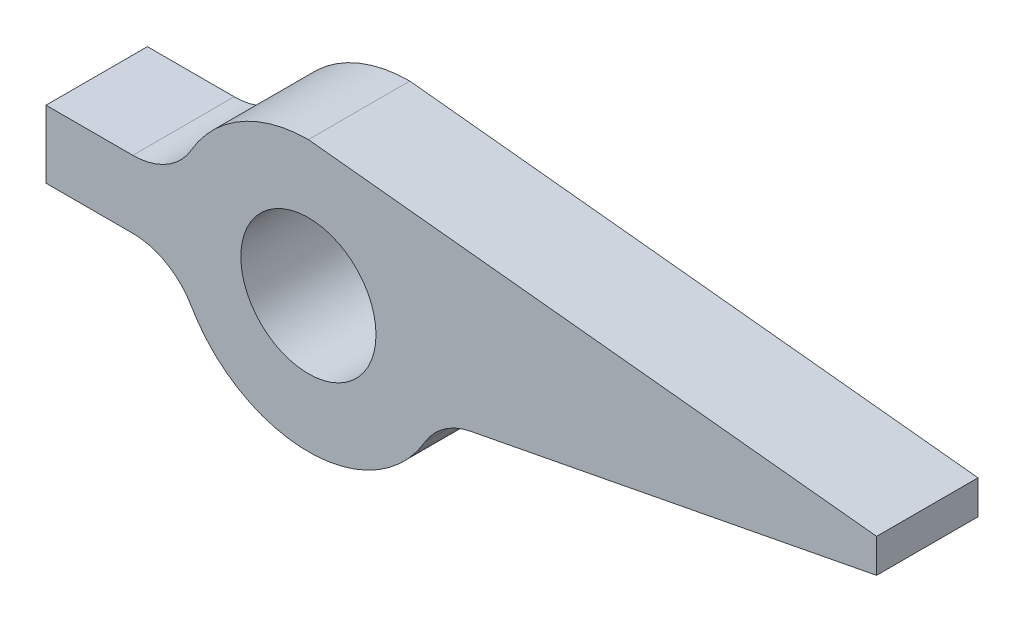
ISO-10303-21;
HEADER;
FILE_DESCRIPTION(('STEP AP214'),'2;1');
FILE_NAME('part.step','',(''),(''),'','','');
FILE_SCHEMA(('AUTOMOTIVE_DESIGN { 1 0 10303 214 1 1 1 1 }'));
ENDSEC;
DATA;
#1=APPLICATION_CONTEXT('core data for automotive mechanical design processes');
#2=APPLICATION_PROTOCOL_DEFINITION('international standard','automotive_design',2000,#1);
#3=PRODUCT_CONTEXT('',#1,'mechanical');
#4=PRODUCT('Part','Part','',(#3));
#5=PRODUCT_RELATED_PRODUCT_CATEGORY('part','',(#4));
#6=PRODUCT_DEFINITION_FORMATION('','',#4);
#7=PRODUCT_DEFINITION_CONTEXT('part definition',#1,'design');
#8=PRODUCT_DEFINITION('design','',#6,#7);
#9=PRODUCT_DEFINITION_SHAPE('','',#8);
#10=(LENGTH_UNIT() NAMED_UNIT(*) SI_UNIT(.MILLI.,.METRE.));
#11=(NAMED_UNIT(*) PLANE_ANGLE_UNIT() SI_UNIT($,.RADIAN.));
#12=(NAMED_UNIT(*) SI_UNIT($,.STERADIAN.) SOLID_ANGLE_UNIT());
#13=UNCERTAINTY_MEASURE_WITH_UNIT(LENGTH_MEASURE(1.E-05),#10,'distance_accuracy_value','');
#14=(GEOMETRIC_REPRESENTATION_CONTEXT(3) GLOBAL_UNCERTAINTY_ASSIGNED_CONTEXT((#13)) GLOBAL_UNIT_ASSIGNED_CONTEXT((#10,
#11,#12)) REPRESENTATION_CONTEXT('',''));
#15=CARTESIAN_POINT('',(0.,0.,0.));
#16=DIRECTION('',(0.,0.,1.));
#17=DIRECTION('',(1.,0.,0.));
#18=AXIS2_PLACEMENT_3D('',#15,#16,#17);
#19=CARTESIAN_POINT('',(1.80959474624118,17.2869736289204,1.5));
#20=DIRECTION('',(0.104110812603087,0.994565703560667,0.));
#21=DIRECTION('',(-0.994565703560667,0.104110812603087,0.));
#22=AXIS2_PLACEMENT_3D('',#19,#20,#21);
#23=PLANE('',#22);
#24=DIRECTION('',(0.994565703560667,-0.104110812603087,0.));
#25=VECTOR('',#24,1.);
#26=CARTESIAN_POINT('',(1.80959474624118,17.2869736289204,0.));
#27=LINE('',#26,#25);
#28=CARTESIAN_POINT('',(-11.2160550410776,18.6504943889727,0.));
#29=VERTEX_POINT('',#28);
#30=CARTESIAN_POINT('',(-2.80993463836175,17.7705444542093,0.));
#31=VERTEX_POINT('',#30);
#32=EDGE_CURVE('E123',#29,#31,#27,.T.);
#33=ORIENTED_EDGE('',*,*,#32,.F.);
#34=DIRECTION('',(0.,0.,-1.));
#35=VECTOR('',#34,1.);
#36=CARTESIAN_POINT('',(-11.2160550410776,18.6504943889727,1.5));
#37=LINE('',#36,#35);
#38=CARTESIAN_POINT('',(-11.2160550410776,18.6504943889727,1.5));
#39=VERTEX_POINT('',#38);
#40=EDGE_CURVE('E117',#39,#29,#37,.T.);
#41=ORIENTED_EDGE('',*,*,#40,.F.);
#42=DIRECTION('',(0.994565703560667,-0.104110812603087,0.));
#43=VECTOR('',#42,1.);
#44=CARTESIAN_POINT('',(1.80959474624118,17.2869736289204,1.5));
#45=LINE('',#44,#43);
#46=CARTESIAN_POINT('',(-2.80993463836175,17.7705444542093,1.5));
#47=VERTEX_POINT('',#46);
#48=EDGE_CURVE('E120',#39,#47,#45,.T.);
#49=ORIENTED_EDGE('',*,*,#48,.T.);
#50=DIRECTION('',(0.,0.,-1.));
#51=VECTOR('',#50,1.);
#52=CARTESIAN_POINT('',(-2.80993463836175,17.7705444542093,1.5));
#53=LINE('',#52,#51);
#54=EDGE_CURVE('E166',#47,#31,#53,.T.);
#55=ORIENTED_EDGE('',*,*,#54,.T.);
#56=EDGE_LOOP('',(#33,#41,#49,#55));
#57=FACE_BOUND('',#56,.T.);
#58=ADVANCED_FACE('F34',(#57),#23,.T.);
#59=CARTESIAN_POINT('',(-11.2160550410776,16.6504943889727,1.5));
#60=DIRECTION('',(0.,0.,-1.));
#61=DIRECTION('',(-1.,0.,0.));
#62=AXIS2_PLACEMENT_3D('',#59,#60,#61);
#63=CYLINDRICAL_SURFACE('',#62,2.);
#64=CARTESIAN_POINT('',(-11.2160550410776,16.6504943889727,0.));
#65=DIRECTION('',(0.,0.,1.));
#66=DIRECTION('',(1.,0.,0.));
#67=AXIS2_PLACEMENT_3D('',#64,#65,#66);
#68=CIRCLE('',#67,2.);
#69=CARTESIAN_POINT('',(-12.9481058486464,17.6504943889727,0.));
#70=VERTEX_POINT('',#69);
#71=EDGE_CURVE('E168',#29,#70,#68,.T.);
#72=ORIENTED_EDGE('',*,*,#71,.T.);
#73=DIRECTION('',(0.,0.,-1.));
#74=VECTOR('',#73,1.);
#75=CARTESIAN_POINT('',(-12.9481058486464,17.6504943889727,1.5));
#76=LINE('',#75,#74);
#77=CARTESIAN_POINT('',(-12.9481058486464,17.6504943889727,1.5));
#78=VERTEX_POINT('',#77);
#79=EDGE_CURVE('E134',#70,#78,#76,.F.);
#80=ORIENTED_EDGE('',*,*,#79,.T.);
#81=CARTESIAN_POINT('',(-11.2160550410776,16.6504943889727,1.5));
#82=DIRECTION('',(0.,0.,1.));
#83=DIRECTION('',(1.,0.,0.));
#84=AXIS2_PLACEMENT_3D('',#81,#82,#83);
#85=CIRCLE('',#84,2.);
#86=EDGE_CURVE('E131',#39,#78,#85,.T.);
#87=ORIENTED_EDGE('',*,*,#86,.F.);
#88=ORIENTED_EDGE('',*,*,#40,.T.);
#89=EDGE_LOOP('',(#72,#80,#87,#88));
#90=FACE_BOUND('',#89,.T.);
#91=ADVANCED_FACE('F132',(#90),#63,.T.);
#92=CARTESIAN_POINT('',(0.,17.1504943889727,1.5));
#93=DIRECTION('',(0.,1.,0.));
#94=DIRECTION('',(0.,0.,1.));
#95=AXIS2_PLACEMENT_3D('',#92,#93,#94);
#96=PLANE('',#95);
#97=DIRECTION('',(1.,0.,0.));
#98=VECTOR('',#97,1.);
#99=CARTESIAN_POINT('',(0.,17.1504943889727,1.5));
#100=LINE('',#99,#98);
#101=CARTESIAN_POINT('',(-15.0981058486465,17.1504943889727,1.5));
#102=VERTEX_POINT('',#101);
#103=CARTESIAN_POINT('',(-13.8141312524309,17.1504943889727,1.5));
#104=VERTEX_POINT('',#103);
#105=EDGE_CURVE('E137',#102,#104,#100,.T.);
#106=ORIENTED_EDGE('',*,*,#105,.T.);
#107=DIRECTION('',(0.,0.,-1.));
#108=VECTOR('',#107,1.);
#109=CARTESIAN_POINT('',(-13.8141312524309,17.1504943889727,1.5));
#110=LINE('',#109,#108);
#111=CARTESIAN_POINT('',(-13.8141312524309,17.1504943889727,0.));
#112=VERTEX_POINT('',#111);
#113=EDGE_CURVE('E198',#104,#112,#110,.T.);
#114=ORIENTED_EDGE('',*,*,#113,.T.);
#115=DIRECTION('',(1.,0.,0.));
#116=VECTOR('',#115,1.);
#117=CARTESIAN_POINT('',(0.,17.1504943889727,0.));
#118=LINE('',#117,#116);
#119=CARTESIAN_POINT('',(-15.0981058486465,17.1504943889727,0.));
#120=VERTEX_POINT('',#119);
#121=EDGE_CURVE('E170',#120,#112,#118,.T.);
#122=ORIENTED_EDGE('',*,*,#121,.F.);
#123=DIRECTION('',(0.,0.,-1.));
#124=VECTOR('',#123,1.);
#125=CARTESIAN_POINT('',(-15.0981058486465,17.1504943889727,1.5));
#126=LINE('',#125,#124);
#127=EDGE_CURVE('E128',#102,#120,#126,.T.);
#128=ORIENTED_EDGE('',*,*,#127,.F.);
#129=EDGE_LOOP('',(#106,#114,#122,#128));
#130=FACE_BOUND('',#129,.T.);
#131=ADVANCED_FACE('F232',(#130),#96,.T.);
#132=CARTESIAN_POINT('',(-15.0981058486465,0.,1.5));
#133=DIRECTION('',(-1.,0.,0.));
#134=DIRECTION('',(0.,0.,1.));
#135=AXIS2_PLACEMENT_3D('',#132,#133,#134);
#136=PLANE('',#135);
#137=DIRECTION('',(0.,1.,0.));
#138=VECTOR('',#137,1.);
#139=CARTESIAN_POINT('',(-15.0981058486465,0.,0.));
#140=LINE('',#139,#138);
#141=CARTESIAN_POINT('',(-15.0981058486465,16.1504943889727,0.));
#142=VERTEX_POINT('',#141);
#143=EDGE_CURVE('E174',#142,#120,#140,.T.);
#144=ORIENTED_EDGE('',*,*,#143,.F.);
#145=DIRECTION('',(0.,0.,-1.));
#146=VECTOR('',#145,1.);
#147=CARTESIAN_POINT('',(-15.0981058486465,16.1504943889727,1.5));
#148=LINE('',#147,#146);
#149=CARTESIAN_POINT('',(-15.0981058486465,16.1504943889727,1.5));
#150=VERTEX_POINT('',#149);
#151=EDGE_CURVE('E187',#150,#142,#148,.T.);
#152=ORIENTED_EDGE('',*,*,#151,.F.);
#153=DIRECTION('',(0.,1.,0.));
#154=VECTOR('',#153,1.);
#155=CARTESIAN_POINT('',(-15.0981058486465,0.,1.5));
#156=LINE('',#155,#154);
#157=EDGE_CURVE('E153',#150,#102,#156,.T.);
#158=ORIENTED_EDGE('',*,*,#157,.T.);
#159=ORIENTED_EDGE('',*,*,#127,.T.);
#160=EDGE_LOOP('',(#144,#152,#158,#159));
#161=FACE_BOUND('',#160,.T.);
#162=ADVANCED_FACE('F254',(#161),#136,.T.);
#163=CARTESIAN_POINT('',(0.,16.1504943889727,1.5));
#164=DIRECTION('',(0.,1.,0.));
#165=DIRECTION('',(0.,0.,1.));
#166=AXIS2_PLACEMENT_3D('',#163,#164,#165);
#167=PLANE('',#166);
#168=DIRECTION('',(1.,0.,0.));
#169=VECTOR('',#168,1.);
#170=CARTESIAN_POINT('',(0.,16.1504943889727,0.));
#171=LINE('',#170,#169);
#172=CARTESIAN_POINT('',(-13.8141312524309,16.1504943889727,0.));
#173=VERTEX_POINT('',#172);
#174=EDGE_CURVE('E177',#142,#173,#171,.T.);
#175=ORIENTED_EDGE('',*,*,#174,.T.);
#176=DIRECTION('',(0.,0.,1.));
#177=VECTOR('',#176,1.);
#178=CARTESIAN_POINT('',(-13.8141312524309,16.1504943889727,1.5));
#179=LINE('',#178,#177);
#180=CARTESIAN_POINT('',(-13.8141312524309,16.1504943889727,1.5));
#181=VERTEX_POINT('',#180);
#182=EDGE_CURVE('E192',#173,#181,#179,.T.);
#183=ORIENTED_EDGE('',*,*,#182,.T.);
#184=DIRECTION('',(1.,0.,0.));
#185=VECTOR('',#184,1.);
#186=CARTESIAN_POINT('',(0.,16.1504943889727,1.5));
#187=LINE('',#186,#185);
#188=EDGE_CURVE('E156',#150,#181,#187,.T.);
#189=ORIENTED_EDGE('',*,*,#188,.F.);
#190=ORIENTED_EDGE('',*,*,#151,.T.);
#191=EDGE_LOOP('',(#175,#183,#189,#190));
#192=FACE_BOUND('',#191,.T.);
#193=ADVANCED_FACE('F252',(#192),#167,.F.);
#194=CARTESIAN_POINT('',(-12.9481058486465,15.6504943889727,0.));
#195=VERTEX_POINT('',#194);
#196=CARTESIAN_POINT('',(-9.49174390059453,15.6372071193369,0.));
#197=VERTEX_POINT('',#196);
#198=EDGE_CURVE('E171',#195,#197,#68,.T.);
#199=ORIENTED_EDGE('',*,*,#198,.T.);
#200=DIRECTION('',(0.,0.,-1.));
#201=VECTOR('',#200,1.);
#202=CARTESIAN_POINT('',(-9.49174390059453,15.6372071193369,1.5));
#203=LINE('',#202,#201);
#204=CARTESIAN_POINT('',(-9.49174390059453,15.6372071193369,1.5));
#205=VERTEX_POINT('',#204);
#206=EDGE_CURVE('E55',#197,#205,#203,.F.);
#207=ORIENTED_EDGE('',*,*,#206,.T.);
#208=CARTESIAN_POINT('',(-12.9481058486465,15.6504943889727,1.5));
#209=VERTEX_POINT('',#208);
#210=EDGE_CURVE('E139',#209,#205,#85,.T.);
#211=ORIENTED_EDGE('',*,*,#210,.F.);
#212=DIRECTION('',(0.,0.,-1.));
#213=VECTOR('',#212,1.);
#214=CARTESIAN_POINT('',(-12.9481058486465,15.6504943889727,1.5));
#215=LINE('',#214,#213);
#216=EDGE_CURVE('E127',#209,#195,#215,.T.);
#217=ORIENTED_EDGE('',*,*,#216,.T.);
#218=EDGE_LOOP('',(#199,#207,#211,#217));
#219=FACE_BOUND('',#218,.T.);
#220=ADVANCED_FACE('F234',(#219),#63,.T.);
#221=CARTESIAN_POINT('',(-3.30985748814705,17.1741979820429,1.5));
#222=DIRECTION('',(0.189240336746254,-0.981930799470189,0.));
#223=DIRECTION('',(0.981930799470189,0.189240336746254,0.));
#224=AXIS2_PLACEMENT_3D('',#221,#222,#223);
#225=PLANE('',#224);
#226=DIRECTION('',(-0.981930799470189,-0.189240336746254,0.));
#227=VECTOR('',#226,1.);
#228=CARTESIAN_POINT('',(-3.30985748814705,17.1741979820429,1.5));
#229=LINE('',#228,#227);
#230=CARTESIAN_POINT('',(-2.80993463836175,17.2705444542093,1.5));
#231=VERTEX_POINT('',#230);
#232=CARTESIAN_POINT('',(-8.81882866709926,16.1124942839892,1.5));
#233=VERTEX_POINT('',#232);
#234=EDGE_CURVE('E159',#231,#233,#229,.T.);
#235=ORIENTED_EDGE('',*,*,#234,.T.);
#236=DIRECTION('',(0.,0.,-1.));
#237=VECTOR('',#236,1.);
#238=CARTESIAN_POINT('',(-8.81882866709926,16.1124942839892,1.5));
#239=LINE('',#238,#237);
#240=CARTESIAN_POINT('',(-8.81882866709926,16.1124942839892,0.));
#241=VERTEX_POINT('',#240);
#242=EDGE_CURVE('E206',#233,#241,#239,.T.);
#243=ORIENTED_EDGE('',*,*,#242,.T.);
#244=DIRECTION('',(-0.981930799470189,-0.189240336746254,0.));
#245=VECTOR('',#244,1.);
#246=CARTESIAN_POINT('',(-3.30985748814705,17.1741979820429,0.));
#247=LINE('',#246,#245);
#248=CARTESIAN_POINT('',(-2.80993463836175,17.2705444542093,0.));
#249=VERTEX_POINT('',#248);
#250=EDGE_CURVE('E180',#249,#241,#247,.T.);
#251=ORIENTED_EDGE('',*,*,#250,.F.);
#252=DIRECTION('',(0.,0.,-1.));
#253=VECTOR('',#252,1.);
#254=CARTESIAN_POINT('',(-2.80993463836175,17.2705444542093,1.5));
#255=LINE('',#254,#253);
#256=EDGE_CURVE('E185',#231,#249,#255,.T.);
#257=ORIENTED_EDGE('',*,*,#256,.F.);
#258=EDGE_LOOP('',(#235,#243,#251,#257));
#259=FACE_BOUND('',#258,.T.);
#260=ADVANCED_FACE('F212',(#259),#225,.T.);
#261=CARTESIAN_POINT('',(-2.80993463836174,0.,1.5));
#262=DIRECTION('',(1.,0.,0.));
#263=DIRECTION('',(0.,1.,0.));
#264=AXIS2_PLACEMENT_3D('',#261,#262,#263);
#265=PLANE('',#264);
#266=DIRECTION('',(0.,-1.,0.));
#267=VECTOR('',#266,1.);
#268=CARTESIAN_POINT('',(-2.80993463836174,0.,0.));
#269=LINE('',#268,#267);
#270=EDGE_CURVE('E148',#31,#249,#269,.T.);
#271=ORIENTED_EDGE('',*,*,#270,.F.);
#272=ORIENTED_EDGE('',*,*,#54,.F.);
#273=DIRECTION('',(0.,-1.,0.));
#274=VECTOR('',#273,1.);
#275=CARTESIAN_POINT('',(-2.80993463836174,0.,1.5));
#276=LINE('',#275,#274);
#277=EDGE_CURVE('E144',#47,#231,#276,.T.);
#278=ORIENTED_EDGE('',*,*,#277,.T.);
#279=ORIENTED_EDGE('',*,*,#256,.T.);
#280=EDGE_LOOP('',(#271,#272,#278,#279));
#281=FACE_BOUND('',#280,.T.);
#282=ADVANCED_FACE('F219',(#281),#265,.T.);
#283=CARTESIAN_POINT('',(-11.2160550410776,16.6504943889727,1.5));
#284=DIRECTION('',(0.,0.,-1.));
#285=DIRECTION('',(-1.,0.,0.));
#286=AXIS2_PLACEMENT_3D('',#283,#284,#285);
#287=CYLINDRICAL_SURFACE('',#286,1.);
#288=CARTESIAN_POINT('',(-11.2160550410776,16.6504943889727,1.5));
#289=DIRECTION('',(0.,0.,1.));
#290=DIRECTION('',(1.,0.,0.));
#291=AXIS2_PLACEMENT_3D('',#288,#289,#290);
#292=CIRCLE('',#291,1.);
#293=CARTESIAN_POINT('',(-10.2160550410776,16.6504943889727,1.5));
#294=VERTEX_POINT('',#293);
#295=EDGE_CURVE('E163',#294,#294,#292,.T.);
#296=ORIENTED_EDGE('',*,*,#295,.T.);
#297=EDGE_LOOP('',(#296));
#298=FACE_BOUND('',#297,.T.);
#299=CARTESIAN_POINT('',(-11.2160550410776,16.6504943889727,0.));
#300=DIRECTION('',(0.,0.,1.));
#301=DIRECTION('',(1.,0.,0.));
#302=AXIS2_PLACEMENT_3D('',#299,#300,#301);
#303=CIRCLE('',#302,1.);
#304=CARTESIAN_POINT('',(-10.2160550410776,16.6504943889727,0.));
#305=VERTEX_POINT('',#304);
#306=EDGE_CURVE('E145',#305,#305,#303,.T.);
#307=ORIENTED_EDGE('',*,*,#306,.F.);
#308=EDGE_LOOP('',(#307));
#309=FACE_BOUND('',#308,.T.);
#310=ADVANCED_FACE('F273',(#298,#309),#287,.F.);
#311=CARTESIAN_POINT('',(0.,0.,1.5));
#312=DIRECTION('',(0.,0.,1.));
#313=DIRECTION('',(1.,0.,0.));
#314=AXIS2_PLACEMENT_3D('',#311,#312,#313);
#315=PLANE('',#314);
#316=ORIENTED_EDGE('',*,*,#48,.F.);
#317=ORIENTED_EDGE('',*,*,#86,.T.);
#318=CARTESIAN_POINT('',(-13.8141312524309,18.1504943889727,1.5));
#319=DIRECTION('',(0.,0.,1.));
#320=DIRECTION('',(1.,0.,0.));
#321=AXIS2_PLACEMENT_3D('',#318,#319,#320);
#322=CIRCLE('',#321,1.);
#323=EDGE_CURVE('E204',#78,#104,#322,.F.);
#324=ORIENTED_EDGE('',*,*,#323,.T.);
#325=ORIENTED_EDGE('',*,*,#105,.F.);
#326=ORIENTED_EDGE('',*,*,#157,.F.);
#327=ORIENTED_EDGE('',*,*,#188,.T.);
#328=CARTESIAN_POINT('',(-13.8141312524309,15.1504943889727,1.5));
#329=DIRECTION('',(0.,0.,1.));
#330=DIRECTION('',(1.,0.,0.));
#331=AXIS2_PLACEMENT_3D('',#328,#329,#330);
#332=CIRCLE('',#331,1.);
#333=EDGE_CURVE('E196',#181,#209,#332,.F.);
#334=ORIENTED_EDGE('',*,*,#333,.T.);
#335=ORIENTED_EDGE('',*,*,#210,.T.);
#336=CARTESIAN_POINT('',(-8.629588330353,15.130563484519,1.5));
#337=DIRECTION('',(0.,0.,1.));
#338=DIRECTION('',(1.,0.,0.));
#339=AXIS2_PLACEMENT_3D('',#336,#337,#338);
#340=CIRCLE('',#339,1.);
#341=EDGE_CURVE('E11',#205,#233,#340,.F.);
#342=ORIENTED_EDGE('',*,*,#341,.T.);
#343=ORIENTED_EDGE('',*,*,#234,.F.);
#344=ORIENTED_EDGE('',*,*,#277,.F.);
#345=EDGE_LOOP('',(#316,#317,#324,#325,#326,#327,#334,#335,#342,#343,#344));
#346=FACE_BOUND('',#345,.T.);
#347=ORIENTED_EDGE('',*,*,#295,.F.);
#348=EDGE_LOOP('',(#347));
#349=FACE_BOUND('',#348,.T.);
#350=ADVANCED_FACE('F140',(#346,#349),#315,.T.);
#351=CARTESIAN_POINT('',(0.,0.,0.));
#352=DIRECTION('',(0.,0.,1.));
#353=DIRECTION('',(1.,0.,0.));
#354=AXIS2_PLACEMENT_3D('',#351,#352,#353);
#355=PLANE('',#354);
#356=ORIENTED_EDGE('',*,*,#32,.T.);
#357=ORIENTED_EDGE('',*,*,#270,.T.);
#358=ORIENTED_EDGE('',*,*,#250,.T.);
#359=CARTESIAN_POINT('',(-8.629588330353,15.130563484519,0.));
#360=DIRECTION('',(0.,0.,1.));
#361=DIRECTION('',(1.,0.,0.));
#362=AXIS2_PLACEMENT_3D('',#359,#360,#361);
#363=CIRCLE('',#362,1.);
#364=EDGE_CURVE('E42',#241,#197,#363,.T.);
#365=ORIENTED_EDGE('',*,*,#364,.T.);
#366=ORIENTED_EDGE('',*,*,#198,.F.);
#367=CARTESIAN_POINT('',(-13.8141312524309,15.1504943889727,0.));
#368=DIRECTION('',(0.,0.,1.));
#369=DIRECTION('',(1.,0.,0.));
#370=AXIS2_PLACEMENT_3D('',#367,#368,#369);
#371=CIRCLE('',#370,1.);
#372=EDGE_CURVE('E194',#195,#173,#371,.T.);
#373=ORIENTED_EDGE('',*,*,#372,.T.);
#374=ORIENTED_EDGE('',*,*,#174,.F.);
#375=ORIENTED_EDGE('',*,*,#143,.T.);
#376=ORIENTED_EDGE('',*,*,#121,.T.);
#377=CARTESIAN_POINT('',(-13.8141312524309,18.1504943889727,0.));
#378=DIRECTION('',(0.,0.,1.));
#379=DIRECTION('',(1.,0.,0.));
#380=AXIS2_PLACEMENT_3D('',#377,#378,#379);
#381=CIRCLE('',#380,1.);
#382=EDGE_CURVE('E202',#112,#70,#381,.T.);
#383=ORIENTED_EDGE('',*,*,#382,.T.);
#384=ORIENTED_EDGE('',*,*,#71,.F.);
#385=EDGE_LOOP('',(#356,#357,#358,#365,#366,#373,#374,#375,#376,#383,#384));
#386=FACE_BOUND('',#385,.T.);
#387=ORIENTED_EDGE('',*,*,#306,.T.);
#388=EDGE_LOOP('',(#387));
#389=FACE_BOUND('',#388,.T.);
#390=ADVANCED_FACE('F215',(#386,#389),#355,.F.);
#391=CARTESIAN_POINT('',(-13.8141312524309,15.1504943889727,1.5));
#392=DIRECTION('',(0.,0.,-1.));
#393=DIRECTION('',(-1.,0.,0.));
#394=AXIS2_PLACEMENT_3D('',#391,#392,#393);
#395=CYLINDRICAL_SURFACE('',#394,1.);
#396=ORIENTED_EDGE('',*,*,#333,.F.);
#397=ORIENTED_EDGE('',*,*,#182,.F.);
#398=ORIENTED_EDGE('',*,*,#372,.F.);
#399=ORIENTED_EDGE('',*,*,#216,.F.);
#400=EDGE_LOOP('',(#396,#397,#398,#399));
#401=FACE_BOUND('',#400,.T.);
#402=ADVANCED_FACE('F225',(#401),#395,.F.);
#403=CARTESIAN_POINT('',(-13.8141312524309,18.1504943889727,1.5));
#404=DIRECTION('',(0.,0.,-1.));
#405=DIRECTION('',(-1.,0.,0.));
#406=AXIS2_PLACEMENT_3D('',#403,#404,#405);
#407=CYLINDRICAL_SURFACE('',#406,1.);
#408=ORIENTED_EDGE('',*,*,#323,.F.);
#409=ORIENTED_EDGE('',*,*,#79,.F.);
#410=ORIENTED_EDGE('',*,*,#382,.F.);
#411=ORIENTED_EDGE('',*,*,#113,.F.);
#412=EDGE_LOOP('',(#408,#409,#410,#411));
#413=FACE_BOUND('',#412,.T.);
#414=ADVANCED_FACE('F221',(#413),#407,.F.);
#415=CARTESIAN_POINT('',(-8.629588330353,15.130563484519,1.5));
#416=DIRECTION('',(0.,0.,-1.));
#417=DIRECTION('',(-1.,0.,0.));
#418=AXIS2_PLACEMENT_3D('',#415,#416,#417);
#419=CYLINDRICAL_SURFACE('',#418,1.);
#420=ORIENTED_EDGE('',*,*,#341,.F.);
#421=ORIENTED_EDGE('',*,*,#206,.F.);
#422=ORIENTED_EDGE('',*,*,#364,.F.);
#423=ORIENTED_EDGE('',*,*,#242,.F.);
#424=EDGE_LOOP('',(#420,#421,#422,#423));
#425=FACE_BOUND('',#424,.T.);
#426=ADVANCED_FACE('F36',(#425),#419,.F.);
#427=CLOSED_SHELL('',(#58,#91,#131,#162,#193,#220,#260,#282,#310,#350,#390,#402,#414,#426));
#428=MANIFOLD_SOLID_BREP('B2',#427);
#429=ADVANCED_BREP_SHAPE_REPRESENTATION('',(#18,#428),#14);
#430=SHAPE_DEFINITION_REPRESENTATION(#9,#429);
ENDSEC;
END-ISO-10303-21;
